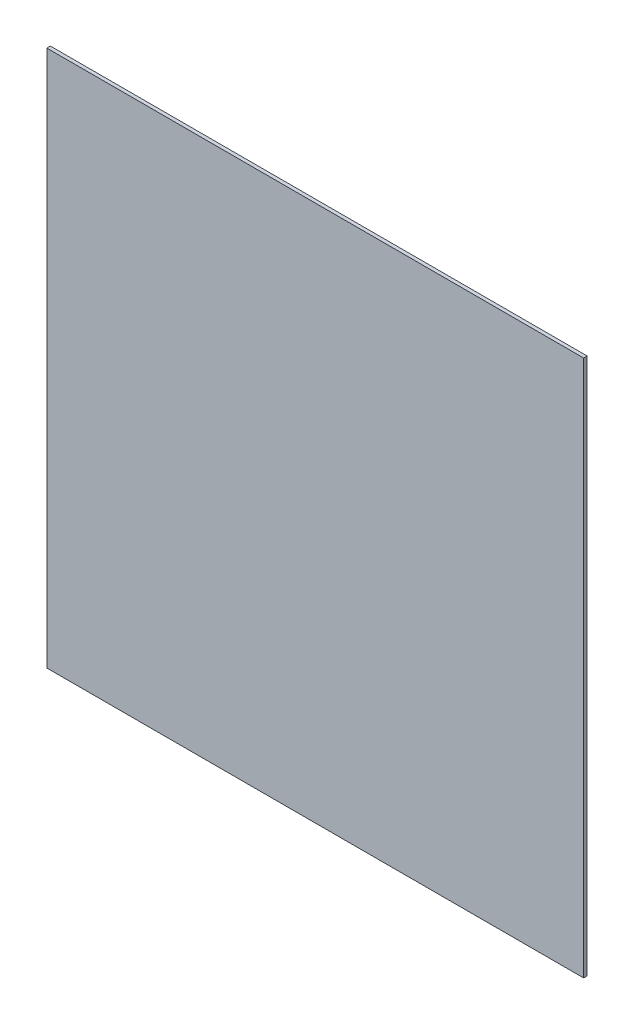
ISO-10303-21;
HEADER;
FILE_DESCRIPTION(('STEP AP214'),'2;1');
FILE_NAME('part.step','',(''),(''),'','','');
FILE_SCHEMA(('AUTOMOTIVE_DESIGN { 1 0 10303 214 1 1 1 1 }'));
ENDSEC;
DATA;
#1=APPLICATION_CONTEXT('core data for automotive mechanical design processes');
#2=APPLICATION_PROTOCOL_DEFINITION('international standard','automotive_design',2000,#1);
#3=PRODUCT_CONTEXT('',#1,'mechanical');
#4=PRODUCT('Part','Part','',(#3));
#5=PRODUCT_RELATED_PRODUCT_CATEGORY('part','',(#4));
#6=PRODUCT_DEFINITION_FORMATION('','',#4);
#7=PRODUCT_DEFINITION_CONTEXT('part definition',#1,'design');
#8=PRODUCT_DEFINITION('design','',#6,#7);
#9=PRODUCT_DEFINITION_SHAPE('','',#8);
#10=(LENGTH_UNIT() NAMED_UNIT(*) SI_UNIT(.MILLI.,.METRE.));
#11=(NAMED_UNIT(*) PLANE_ANGLE_UNIT() SI_UNIT($,.RADIAN.));
#12=(NAMED_UNIT(*) SI_UNIT($,.STERADIAN.) SOLID_ANGLE_UNIT());
#13=UNCERTAINTY_MEASURE_WITH_UNIT(LENGTH_MEASURE(1.E-05),#10,'distance_accuracy_value','');
#14=(GEOMETRIC_REPRESENTATION_CONTEXT(3) GLOBAL_UNCERTAINTY_ASSIGNED_CONTEXT((#13)) GLOBAL_UNIT_ASSIGNED_CONTEXT((#10,
#11,#12)) REPRESENTATION_CONTEXT('',''));
#15=CARTESIAN_POINT('',(0.,0.,0.));
#16=DIRECTION('',(0.,0.,1.));
#17=DIRECTION('',(1.,0.,0.));
#18=AXIS2_PLACEMENT_3D('',#15,#16,#17);
#19=CARTESIAN_POINT('',(23.0808835213728,1509.05085015096,10.));
#20=DIRECTION('',(-1.,0.,0.));
#21=DIRECTION('',(0.,-1.,0.));
#22=AXIS2_PLACEMENT_3D('',#19,#20,#21);
#23=PLANE('',#22);
#24=DIRECTION('',(0.,1.,0.));
#25=VECTOR('',#24,1.);
#26=CARTESIAN_POINT('',(23.0808835213728,1509.05085015096,0.));
#27=LINE('',#26,#25);
#28=CARTESIAN_POINT('',(23.0808835213729,-15.9491498490386,0.));
#29=VERTEX_POINT('',#28);
#30=CARTESIAN_POINT('',(23.0808835213728,1509.05085015096,0.));
#31=VERTEX_POINT('',#30);
#32=EDGE_CURVE('E98',#29,#31,#27,.T.);
#33=ORIENTED_EDGE('',*,*,#32,.T.);
#34=DIRECTION('',(0.,0.,-1.));
#35=VECTOR('',#34,1.);
#36=CARTESIAN_POINT('',(23.0808835213728,1509.05085015096,10.));
#37=LINE('',#36,#35);
#38=CARTESIAN_POINT('',(23.0808835213728,1509.05085015096,10.));
#39=VERTEX_POINT('',#38);
#40=EDGE_CURVE('E11',#39,#31,#37,.T.);
#41=ORIENTED_EDGE('',*,*,#40,.F.);
#42=DIRECTION('',(0.,1.,0.));
#43=VECTOR('',#42,1.);
#44=CARTESIAN_POINT('',(23.0808835213728,1509.05085015096,10.));
#45=LINE('',#44,#43);
#46=CARTESIAN_POINT('',(23.0808835213729,-15.9491498490386,10.));
#47=VERTEX_POINT('',#46);
#48=EDGE_CURVE('E86',#47,#39,#45,.T.);
#49=ORIENTED_EDGE('',*,*,#48,.F.);
#50=DIRECTION('',(0.,0.,-1.));
#51=VECTOR('',#50,1.);
#52=CARTESIAN_POINT('',(23.0808835213729,-15.9491498490386,10.));
#53=LINE('',#52,#51);
#54=EDGE_CURVE('E94',#47,#29,#53,.T.);
#55=ORIENTED_EDGE('',*,*,#54,.T.);
#56=EDGE_LOOP('',(#33,#41,#49,#55));
#57=FACE_BOUND('',#56,.T.);
#58=ADVANCED_FACE('F35',(#57),#23,.F.);
#59=CARTESIAN_POINT('',(-1501.91911647863,1509.05085015096,10.));
#60=DIRECTION('',(0.,-1.,0.));
#61=DIRECTION('',(0.,0.,-1.));
#62=AXIS2_PLACEMENT_3D('',#59,#60,#61);
#63=PLANE('',#62);
#64=DIRECTION('',(-1.,0.,0.));
#65=VECTOR('',#64,1.);
#66=CARTESIAN_POINT('',(-1501.91911647863,1509.05085015096,0.));
#67=LINE('',#66,#65);
#68=CARTESIAN_POINT('',(-1501.91911647863,1509.05085015096,0.));
#69=VERTEX_POINT('',#68);
#70=EDGE_CURVE('E90',#31,#69,#67,.T.);
#71=ORIENTED_EDGE('',*,*,#70,.T.);
#72=DIRECTION('',(0.,0.,-1.));
#73=VECTOR('',#72,1.);
#74=CARTESIAN_POINT('',(-1501.91911647863,1509.05085015096,10.));
#75=LINE('',#74,#73);
#76=CARTESIAN_POINT('',(-1501.91911647863,1509.05085015096,10.));
#77=VERTEX_POINT('',#76);
#78=EDGE_CURVE('E43',#77,#69,#75,.T.);
#79=ORIENTED_EDGE('',*,*,#78,.F.);
#80=DIRECTION('',(-1.,0.,0.));
#81=VECTOR('',#80,1.);
#82=CARTESIAN_POINT('',(-1501.91911647863,1509.05085015096,10.));
#83=LINE('',#82,#81);
#84=EDGE_CURVE('E81',#39,#77,#83,.T.);
#85=ORIENTED_EDGE('',*,*,#84,.F.);
#86=ORIENTED_EDGE('',*,*,#40,.T.);
#87=EDGE_LOOP('',(#71,#79,#85,#86));
#88=FACE_BOUND('',#87,.T.);
#89=ADVANCED_FACE('F89',(#88),#63,.F.);
#90=CARTESIAN_POINT('',(-1501.91911647863,1509.05085015096,10.));
#91=DIRECTION('',(1.,0.,0.));
#92=DIRECTION('',(0.,1.,0.));
#93=AXIS2_PLACEMENT_3D('',#90,#91,#92);
#94=PLANE('',#93);
#95=DIRECTION('',(0.,-1.,0.));
#96=VECTOR('',#95,1.);
#97=CARTESIAN_POINT('',(-1501.91911647863,1509.05085015096,0.));
#98=LINE('',#97,#96);
#99=CARTESIAN_POINT('',(-1501.91911647863,-15.9491498490386,0.));
#100=VERTEX_POINT('',#99);
#101=EDGE_CURVE('E68',#69,#100,#98,.T.);
#102=ORIENTED_EDGE('',*,*,#101,.T.);
#103=DIRECTION('',(0.,0.,-1.));
#104=VECTOR('',#103,1.);
#105=CARTESIAN_POINT('',(-1501.91911647863,-15.9491498490386,10.));
#106=LINE('',#105,#104);
#107=CARTESIAN_POINT('',(-1501.91911647863,-15.9491498490386,10.));
#108=VERTEX_POINT('',#107);
#109=EDGE_CURVE('E91',#108,#100,#106,.T.);
#110=ORIENTED_EDGE('',*,*,#109,.F.);
#111=DIRECTION('',(0.,-1.,0.));
#112=VECTOR('',#111,1.);
#113=CARTESIAN_POINT('',(-1501.91911647863,1509.05085015096,10.));
#114=LINE('',#113,#112);
#115=EDGE_CURVE('E84',#77,#108,#114,.T.);
#116=ORIENTED_EDGE('',*,*,#115,.F.);
#117=ORIENTED_EDGE('',*,*,#78,.T.);
#118=EDGE_LOOP('',(#102,#110,#116,#117));
#119=FACE_BOUND('',#118,.T.);
#120=ADVANCED_FACE('F92',(#119),#94,.F.);
#121=CARTESIAN_POINT('',(-1501.91911647863,-15.9491498490386,10.));
#122=DIRECTION('',(0.,1.,0.));
#123=DIRECTION('',(0.,0.,1.));
#124=AXIS2_PLACEMENT_3D('',#121,#122,#123);
#125=PLANE('',#124);
#126=DIRECTION('',(1.,0.,0.));
#127=VECTOR('',#126,1.);
#128=CARTESIAN_POINT('',(-1501.91911647863,-15.9491498490386,0.));
#129=LINE('',#128,#127);
#130=EDGE_CURVE('E74',#100,#29,#129,.T.);
#131=ORIENTED_EDGE('',*,*,#130,.T.);
#132=ORIENTED_EDGE('',*,*,#54,.F.);
#133=DIRECTION('',(1.,0.,0.));
#134=VECTOR('',#133,1.);
#135=CARTESIAN_POINT('',(-1501.91911647863,-15.9491498490386,10.));
#136=LINE('',#135,#134);
#137=EDGE_CURVE('E51',#108,#47,#136,.T.);
#138=ORIENTED_EDGE('',*,*,#137,.F.);
#139=ORIENTED_EDGE('',*,*,#109,.T.);
#140=EDGE_LOOP('',(#131,#132,#138,#139));
#141=FACE_BOUND('',#140,.T.);
#142=ADVANCED_FACE('F105',(#141),#125,.F.);
#143=CARTESIAN_POINT('',(0.,0.,10.));
#144=DIRECTION('',(0.,0.,1.));
#145=DIRECTION('',(1.,0.,0.));
#146=AXIS2_PLACEMENT_3D('',#143,#144,#145);
#147=PLANE('',#146);
#148=ORIENTED_EDGE('',*,*,#48,.T.);
#149=ORIENTED_EDGE('',*,*,#84,.T.);
#150=ORIENTED_EDGE('',*,*,#115,.T.);
#151=ORIENTED_EDGE('',*,*,#137,.T.);
#152=EDGE_LOOP('',(#148,#149,#150,#151));
#153=FACE_BOUND('',#152,.T.);
#154=ADVANCED_FACE('F82',(#153),#147,.T.);
#155=CARTESIAN_POINT('',(0.,0.,0.));
#156=DIRECTION('',(0.,0.,1.));
#157=DIRECTION('',(1.,0.,0.));
#158=AXIS2_PLACEMENT_3D('',#155,#156,#157);
#159=PLANE('',#158);
#160=ORIENTED_EDGE('',*,*,#32,.F.);
#161=ORIENTED_EDGE('',*,*,#130,.F.);
#162=ORIENTED_EDGE('',*,*,#101,.F.);
#163=ORIENTED_EDGE('',*,*,#70,.F.);
#164=EDGE_LOOP('',(#160,#161,#162,#163));
#165=FACE_BOUND('',#164,.T.);
#166=ADVANCED_FACE('F108',(#165),#159,.F.);
#167=CLOSED_SHELL('',(#58,#89,#120,#142,#154,#166));
#168=MANIFOLD_SOLID_BREP('B2',#167);
#169=ADVANCED_BREP_SHAPE_REPRESENTATION('',(#18,#168),#14);
#170=SHAPE_DEFINITION_REPRESENTATION(#9,#169);
ENDSEC;
END-ISO-10303-21;
